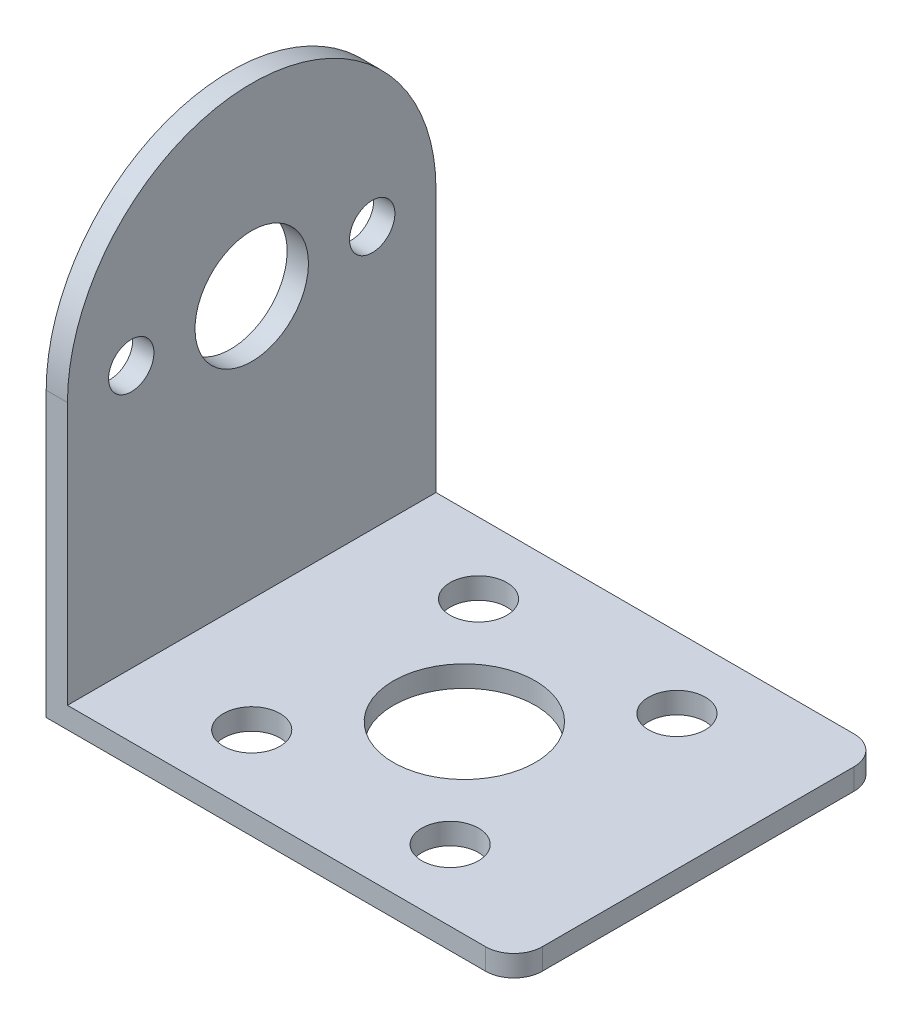
ISO-10303-21;
HEADER;
FILE_DESCRIPTION(('STEP AP214'),'2;1');
FILE_NAME('part.step','',(''),(''),'','','');
FILE_SCHEMA(('AUTOMOTIVE_DESIGN { 1 0 10303 214 1 1 1 1 }'));
ENDSEC;
DATA;
#1=APPLICATION_CONTEXT('core data for automotive mechanical design processes');
#2=APPLICATION_PROTOCOL_DEFINITION('international standard','automotive_design',2000,#1);
#3=PRODUCT_CONTEXT('',#1,'mechanical');
#4=PRODUCT('Part','Part','',(#3));
#5=PRODUCT_RELATED_PRODUCT_CATEGORY('part','',(#4));
#6=PRODUCT_DEFINITION_FORMATION('','',#4);
#7=PRODUCT_DEFINITION_CONTEXT('part definition',#1,'design');
#8=PRODUCT_DEFINITION('design','',#6,#7);
#9=PRODUCT_DEFINITION_SHAPE('','',#8);
#10=(LENGTH_UNIT() NAMED_UNIT(*) SI_UNIT(.MILLI.,.METRE.));
#11=(NAMED_UNIT(*) PLANE_ANGLE_UNIT() SI_UNIT($,.RADIAN.));
#12=(NAMED_UNIT(*) SI_UNIT($,.STERADIAN.) SOLID_ANGLE_UNIT());
#13=UNCERTAINTY_MEASURE_WITH_UNIT(LENGTH_MEASURE(1.E-05),#10,'distance_accuracy_value','');
#14=(GEOMETRIC_REPRESENTATION_CONTEXT(3) GLOBAL_UNCERTAINTY_ASSIGNED_CONTEXT((#13)) GLOBAL_UNIT_ASSIGNED_CONTEXT((#10,
#11,#12)) REPRESENTATION_CONTEXT('',''));
#15=CARTESIAN_POINT('',(0.,0.,0.));
#16=DIRECTION('',(0.,0.,1.));
#17=DIRECTION('',(1.,0.,0.));
#18=AXIS2_PLACEMENT_3D('',#15,#16,#17);
#19=CARTESIAN_POINT('',(0.,0.,26.));
#20=DIRECTION('',(1.,0.,0.));
#21=DIRECTION('',(0.,0.,-1.));
#22=AXIS2_PLACEMENT_3D('',#19,#20,#21);
#23=PLANE('',#22);
#24=CARTESIAN_POINT('',(0.,20.,21.5));
#25=DIRECTION('',(1.,0.,0.));
#26=DIRECTION('',(0.,1.,0.));
#27=AXIS2_PLACEMENT_3D('',#24,#25,#26);
#28=CIRCLE('',#27,1.6);
#29=CARTESIAN_POINT('',(0.,21.6,21.5));
#30=VERTEX_POINT('',#29);
#31=EDGE_CURVE('E254',#30,#30,#28,.T.);
#32=ORIENTED_EDGE('',*,*,#31,.T.);
#33=EDGE_LOOP('',(#32));
#34=FACE_BOUND('',#33,.T.);
#35=CARTESIAN_POINT('',(0.,20.,4.5));
#36=DIRECTION('',(1.,0.,0.));
#37=DIRECTION('',(0.,1.,0.));
#38=AXIS2_PLACEMENT_3D('',#35,#36,#37);
#39=CIRCLE('',#38,1.6);
#40=CARTESIAN_POINT('',(0.,21.6,4.5));
#41=VERTEX_POINT('',#40);
#42=EDGE_CURVE('E260',#41,#41,#39,.T.);
#43=ORIENTED_EDGE('',*,*,#42,.T.);
#44=EDGE_LOOP('',(#43));
#45=FACE_BOUND('',#44,.T.);
#46=CARTESIAN_POINT('',(0.,20.,13.));
#47=DIRECTION('',(1.,0.,0.));
#48=DIRECTION('',(0.,1.,0.));
#49=AXIS2_PLACEMENT_3D('',#46,#47,#48);
#50=CIRCLE('',#49,4.);
#51=CARTESIAN_POINT('',(0.,24.,13.));
#52=VERTEX_POINT('',#51);
#53=EDGE_CURVE('E217',#52,#52,#50,.T.);
#54=ORIENTED_EDGE('',*,*,#53,.T.);
#55=EDGE_LOOP('',(#54));
#56=FACE_BOUND('',#55,.T.);
#57=DIRECTION('',(0.,-1.,0.));
#58=VECTOR('',#57,1.);
#59=CARTESIAN_POINT('',(0.,0.,26.));
#60=LINE('',#59,#58);
#61=CARTESIAN_POINT('',(0.,20.,26.));
#62=VERTEX_POINT('',#61);
#63=CARTESIAN_POINT('',(0.,0.,26.));
#64=VERTEX_POINT('',#63);
#65=EDGE_CURVE('E120',#62,#64,#60,.T.);
#66=ORIENTED_EDGE('',*,*,#65,.F.);
#67=CARTESIAN_POINT('',(0.,20.,13.));
#68=DIRECTION('',(-1.,0.,0.));
#69=DIRECTION('',(0.,1.,0.));
#70=AXIS2_PLACEMENT_3D('',#67,#68,#69);
#71=CIRCLE('',#70,13.);
#72=CARTESIAN_POINT('',(0.,20.,0.));
#73=VERTEX_POINT('',#72);
#74=EDGE_CURVE('E106',#62,#73,#71,.T.);
#75=ORIENTED_EDGE('',*,*,#74,.T.);
#76=DIRECTION('',(0.,-1.,0.));
#77=VECTOR('',#76,1.);
#78=CARTESIAN_POINT('',(0.,0.,0.));
#79=LINE('',#78,#77);
#80=CARTESIAN_POINT('',(0.,0.,0.));
#81=VERTEX_POINT('',#80);
#82=EDGE_CURVE('E118',#73,#81,#79,.T.);
#83=ORIENTED_EDGE('',*,*,#82,.T.);
#84=DIRECTION('',(0.,0.,-1.));
#85=VECTOR('',#84,1.);
#86=CARTESIAN_POINT('',(0.,0.,26.));
#87=LINE('',#86,#85);
#88=EDGE_CURVE('E158',#64,#81,#87,.T.);
#89=ORIENTED_EDGE('',*,*,#88,.F.);
#90=EDGE_LOOP('',(#66,#75,#83,#89));
#91=FACE_BOUND('',#90,.T.);
#92=ADVANCED_FACE('F38',(#34,#45,#56,#91),#23,.F.);
#93=CARTESIAN_POINT('',(0.,0.,26.));
#94=DIRECTION('',(0.,1.,0.));
#95=DIRECTION('',(0.,0.,1.));
#96=AXIS2_PLACEMENT_3D('',#93,#94,#95);
#97=PLANE('',#96);
#98=CARTESIAN_POINT('',(9.50000000000001,0.,21.));
#99=DIRECTION('',(0.,1.,0.));
#100=DIRECTION('',(-1.,0.,0.));
#101=AXIS2_PLACEMENT_3D('',#98,#99,#100);
#102=CIRCLE('',#101,2.);
#103=CARTESIAN_POINT('',(7.50000000000001,0.,21.));
#104=VERTEX_POINT('',#103);
#105=EDGE_CURVE('E216',#104,#104,#102,.T.);
#106=ORIENTED_EDGE('',*,*,#105,.T.);
#107=EDGE_LOOP('',(#106));
#108=FACE_BOUND('',#107,.T.);
#109=CARTESIAN_POINT('',(23.5,0.,21.));
#110=DIRECTION('',(0.,1.,0.));
#111=DIRECTION('',(-1.,0.,0.));
#112=AXIS2_PLACEMENT_3D('',#109,#110,#111);
#113=CIRCLE('',#112,2.);
#114=CARTESIAN_POINT('',(21.5,0.,21.));
#115=VERTEX_POINT('',#114);
#116=EDGE_CURVE('E225',#115,#115,#113,.T.);
#117=ORIENTED_EDGE('',*,*,#116,.T.);
#118=EDGE_LOOP('',(#117));
#119=FACE_BOUND('',#118,.T.);
#120=CARTESIAN_POINT('',(23.5,0.,5.));
#121=DIRECTION('',(0.,1.,0.));
#122=DIRECTION('',(-1.,0.,0.));
#123=AXIS2_PLACEMENT_3D('',#120,#121,#122);
#124=CIRCLE('',#123,2.);
#125=CARTESIAN_POINT('',(21.5,0.,5.));
#126=VERTEX_POINT('',#125);
#127=EDGE_CURVE('E233',#126,#126,#124,.T.);
#128=ORIENTED_EDGE('',*,*,#127,.T.);
#129=EDGE_LOOP('',(#128));
#130=FACE_BOUND('',#129,.T.);
#131=CARTESIAN_POINT('',(9.50000000000001,0.,5.));
#132=DIRECTION('',(0.,1.,0.));
#133=DIRECTION('',(-1.,0.,0.));
#134=AXIS2_PLACEMENT_3D('',#131,#132,#133);
#135=CIRCLE('',#134,2.);
#136=CARTESIAN_POINT('',(7.50000000000001,0.,5.));
#137=VERTEX_POINT('',#136);
#138=EDGE_CURVE('E210',#137,#137,#135,.T.);
#139=ORIENTED_EDGE('',*,*,#138,.T.);
#140=EDGE_LOOP('',(#139));
#141=FACE_BOUND('',#140,.T.);
#142=CARTESIAN_POINT('',(16.5,0.,13.));
#143=DIRECTION('',(0.,1.,0.));
#144=DIRECTION('',(-1.,0.,0.));
#145=AXIS2_PLACEMENT_3D('',#142,#143,#144);
#146=CIRCLE('',#145,5.);
#147=CARTESIAN_POINT('',(11.5,0.,13.));
#148=VERTEX_POINT('',#147);
#149=EDGE_CURVE('E128',#148,#148,#146,.T.);
#150=ORIENTED_EDGE('',*,*,#149,.T.);
#151=EDGE_LOOP('',(#150));
#152=FACE_BOUND('',#151,.T.);
#153=DIRECTION('',(1.,0.,0.));
#154=VECTOR('',#153,1.);
#155=CARTESIAN_POINT('',(0.,0.,0.));
#156=LINE('',#155,#154);
#157=CARTESIAN_POINT('',(31.,0.,0.));
#158=VERTEX_POINT('',#157);
#159=EDGE_CURVE('E125',#81,#158,#156,.T.);
#160=ORIENTED_EDGE('',*,*,#159,.T.);
#161=CARTESIAN_POINT('',(31.,0.,2.));
#162=DIRECTION('',(0.,1.,0.));
#163=DIRECTION('',(0.,0.,1.));
#164=AXIS2_PLACEMENT_3D('',#161,#162,#163);
#165=CIRCLE('',#164,2.);
#166=CARTESIAN_POINT('',(33.,0.,2.00000000000001));
#167=VERTEX_POINT('',#166);
#168=EDGE_CURVE('E47',#158,#167,#165,.F.);
#169=ORIENTED_EDGE('',*,*,#168,.T.);
#170=DIRECTION('',(0.,0.,-1.));
#171=VECTOR('',#170,1.);
#172=CARTESIAN_POINT('',(33.,0.,26.));
#173=LINE('',#172,#171);
#174=CARTESIAN_POINT('',(33.,0.,24.));
#175=VERTEX_POINT('',#174);
#176=EDGE_CURVE('E154',#175,#167,#173,.T.);
#177=ORIENTED_EDGE('',*,*,#176,.F.);
#178=CARTESIAN_POINT('',(31.,0.,24.));
#179=DIRECTION('',(0.,1.,0.));
#180=DIRECTION('',(0.,0.,1.));
#181=AXIS2_PLACEMENT_3D('',#178,#179,#180);
#182=CIRCLE('',#181,2.);
#183=CARTESIAN_POINT('',(31.,0.,26.));
#184=VERTEX_POINT('',#183);
#185=EDGE_CURVE('E62',#175,#184,#182,.F.);
#186=ORIENTED_EDGE('',*,*,#185,.T.);
#187=DIRECTION('',(1.,0.,0.));
#188=VECTOR('',#187,1.);
#189=CARTESIAN_POINT('',(0.,0.,26.));
#190=LINE('',#189,#188);
#191=EDGE_CURVE('E201',#64,#184,#190,.T.);
#192=ORIENTED_EDGE('',*,*,#191,.F.);
#193=ORIENTED_EDGE('',*,*,#88,.T.);
#194=EDGE_LOOP('',(#160,#169,#177,#186,#192,#193));
#195=FACE_BOUND('',#194,.T.);
#196=ADVANCED_FACE('F180',(#108,#119,#130,#141,#152,#195),#97,.F.);
#197=CARTESIAN_POINT('',(33.,0.,26.));
#198=DIRECTION('',(-1.,0.,0.));
#199=DIRECTION('',(0.,-1.,0.));
#200=AXIS2_PLACEMENT_3D('',#197,#198,#199);
#201=PLANE('',#200);
#202=ORIENTED_EDGE('',*,*,#176,.T.);
#203=DIRECTION('',(0.,1.,0.));
#204=VECTOR('',#203,1.);
#205=CARTESIAN_POINT('',(33.,1.5,2.));
#206=LINE('',#205,#204);
#207=CARTESIAN_POINT('',(33.,1.5,2.00000000000001));
#208=VERTEX_POINT('',#207);
#209=EDGE_CURVE('E164',#167,#208,#206,.T.);
#210=ORIENTED_EDGE('',*,*,#209,.T.);
#211=DIRECTION('',(0.,0.,-1.));
#212=VECTOR('',#211,1.);
#213=CARTESIAN_POINT('',(33.,1.5,26.));
#214=LINE('',#213,#212);
#215=CARTESIAN_POINT('',(33.,1.5,24.));
#216=VERTEX_POINT('',#215);
#217=EDGE_CURVE('E150',#216,#208,#214,.T.);
#218=ORIENTED_EDGE('',*,*,#217,.F.);
#219=DIRECTION('',(0.,1.,0.));
#220=VECTOR('',#219,1.);
#221=CARTESIAN_POINT('',(33.,0.,24.));
#222=LINE('',#221,#220);
#223=EDGE_CURVE('E161',#216,#175,#222,.F.);
#224=ORIENTED_EDGE('',*,*,#223,.T.);
#225=EDGE_LOOP('',(#202,#210,#218,#224));
#226=FACE_BOUND('',#225,.T.);
#227=ADVANCED_FACE('F185',(#226),#201,.F.);
#228=CARTESIAN_POINT('',(33.,1.5,26.));
#229=DIRECTION('',(0.,-1.,0.));
#230=DIRECTION('',(1.,0.,0.));
#231=AXIS2_PLACEMENT_3D('',#228,#229,#230);
#232=PLANE('',#231);
#233=CARTESIAN_POINT('',(9.50000000000001,1.5,21.));
#234=DIRECTION('',(0.,1.,0.));
#235=DIRECTION('',(-1.,0.,0.));
#236=AXIS2_PLACEMENT_3D('',#233,#234,#235);
#237=CIRCLE('',#236,2.);
#238=CARTESIAN_POINT('',(7.50000000000001,1.5,21.));
#239=VERTEX_POINT('',#238);
#240=EDGE_CURVE('E212',#239,#239,#237,.T.);
#241=ORIENTED_EDGE('',*,*,#240,.F.);
#242=EDGE_LOOP('',(#241));
#243=FACE_BOUND('',#242,.T.);
#244=CARTESIAN_POINT('',(23.5,1.5,21.));
#245=DIRECTION('',(0.,1.,0.));
#246=DIRECTION('',(-1.,0.,0.));
#247=AXIS2_PLACEMENT_3D('',#244,#245,#246);
#248=CIRCLE('',#247,2.);
#249=CARTESIAN_POINT('',(21.5,1.5,21.));
#250=VERTEX_POINT('',#249);
#251=EDGE_CURVE('E221',#250,#250,#248,.T.);
#252=ORIENTED_EDGE('',*,*,#251,.F.);
#253=EDGE_LOOP('',(#252));
#254=FACE_BOUND('',#253,.T.);
#255=CARTESIAN_POINT('',(23.5,1.5,5.));
#256=DIRECTION('',(0.,1.,0.));
#257=DIRECTION('',(-1.,0.,0.));
#258=AXIS2_PLACEMENT_3D('',#255,#256,#257);
#259=CIRCLE('',#258,2.);
#260=CARTESIAN_POINT('',(21.5,1.5,5.));
#261=VERTEX_POINT('',#260);
#262=EDGE_CURVE('E229',#261,#261,#259,.T.);
#263=ORIENTED_EDGE('',*,*,#262,.F.);
#264=EDGE_LOOP('',(#263));
#265=FACE_BOUND('',#264,.T.);
#266=CARTESIAN_POINT('',(9.50000000000001,1.5,5.));
#267=DIRECTION('',(0.,1.,0.));
#268=DIRECTION('',(-1.,0.,0.));
#269=AXIS2_PLACEMENT_3D('',#266,#267,#268);
#270=CIRCLE('',#269,2.);
#271=CARTESIAN_POINT('',(7.50000000000001,1.5,5.));
#272=VERTEX_POINT('',#271);
#273=EDGE_CURVE('E237',#272,#272,#270,.T.);
#274=ORIENTED_EDGE('',*,*,#273,.F.);
#275=EDGE_LOOP('',(#274));
#276=FACE_BOUND('',#275,.T.);
#277=CARTESIAN_POINT('',(16.5,1.5,13.));
#278=DIRECTION('',(0.,1.,0.));
#279=DIRECTION('',(-1.,0.,0.));
#280=AXIS2_PLACEMENT_3D('',#277,#278,#279);
#281=CIRCLE('',#280,5.);
#282=CARTESIAN_POINT('',(11.5,1.5,13.));
#283=VERTEX_POINT('',#282);
#284=EDGE_CURVE('E135',#283,#283,#281,.T.);
#285=ORIENTED_EDGE('',*,*,#284,.F.);
#286=EDGE_LOOP('',(#285));
#287=FACE_BOUND('',#286,.T.);
#288=ORIENTED_EDGE('',*,*,#217,.T.);
#289=CARTESIAN_POINT('',(31.,1.5,2.));
#290=DIRECTION('',(0.,-1.,0.));
#291=DIRECTION('',(1.,0.,0.));
#292=AXIS2_PLACEMENT_3D('',#289,#290,#291);
#293=CIRCLE('',#292,2.);
#294=CARTESIAN_POINT('',(31.,1.5,0.));
#295=VERTEX_POINT('',#294);
#296=EDGE_CURVE('E171',#208,#295,#293,.F.);
#297=ORIENTED_EDGE('',*,*,#296,.T.);
#298=DIRECTION('',(-1.,0.,0.));
#299=VECTOR('',#298,1.);
#300=CARTESIAN_POINT('',(33.,1.5,0.));
#301=LINE('',#300,#299);
#302=CARTESIAN_POINT('',(1.5,1.49999999999999,0.));
#303=VERTEX_POINT('',#302);
#304=EDGE_CURVE('E132',#295,#303,#301,.T.);
#305=ORIENTED_EDGE('',*,*,#304,.T.);
#306=DIRECTION('',(0.,0.,-1.));
#307=VECTOR('',#306,1.);
#308=CARTESIAN_POINT('',(1.5,1.49999999999999,26.));
#309=LINE('',#308,#307);
#310=CARTESIAN_POINT('',(1.5,1.49999999999999,26.));
#311=VERTEX_POINT('',#310);
#312=EDGE_CURVE('E146',#311,#303,#309,.T.);
#313=ORIENTED_EDGE('',*,*,#312,.F.);
#314=DIRECTION('',(-1.,0.,0.));
#315=VECTOR('',#314,1.);
#316=CARTESIAN_POINT('',(33.,1.5,26.));
#317=LINE('',#316,#315);
#318=CARTESIAN_POINT('',(31.,1.5,26.));
#319=VERTEX_POINT('',#318);
#320=EDGE_CURVE('E198',#319,#311,#317,.T.);
#321=ORIENTED_EDGE('',*,*,#320,.F.);
#322=CARTESIAN_POINT('',(31.,1.5,24.));
#323=DIRECTION('',(0.,-1.,0.));
#324=DIRECTION('',(1.,0.,0.));
#325=AXIS2_PLACEMENT_3D('',#322,#323,#324);
#326=CIRCLE('',#325,2.);
#327=EDGE_CURVE('E168',#319,#216,#326,.F.);
#328=ORIENTED_EDGE('',*,*,#327,.T.);
#329=EDGE_LOOP('',(#288,#297,#305,#313,#321,#328));
#330=FACE_BOUND('',#329,.T.);
#331=ADVANCED_FACE('F191',(#243,#254,#265,#276,#287,#330),#232,.F.);
#332=CARTESIAN_POINT('',(1.5,33.,26.));
#333=DIRECTION('',(-1.,0.,0.));
#334=DIRECTION('',(0.,-1.,0.));
#335=AXIS2_PLACEMENT_3D('',#332,#333,#334);
#336=PLANE('',#335);
#337=CARTESIAN_POINT('',(1.5,20.,21.5));
#338=DIRECTION('',(1.,0.,0.));
#339=DIRECTION('',(0.,1.,0.));
#340=AXIS2_PLACEMENT_3D('',#337,#338,#339);
#341=CIRCLE('',#340,1.6);
#342=CARTESIAN_POINT('',(1.5,21.6,21.5));
#343=VERTEX_POINT('',#342);
#344=EDGE_CURVE('E256',#343,#343,#341,.T.);
#345=ORIENTED_EDGE('',*,*,#344,.F.);
#346=EDGE_LOOP('',(#345));
#347=FACE_BOUND('',#346,.T.);
#348=CARTESIAN_POINT('',(1.5,20.,4.5));
#349=DIRECTION('',(1.,0.,0.));
#350=DIRECTION('',(0.,1.,0.));
#351=AXIS2_PLACEMENT_3D('',#348,#349,#350);
#352=CIRCLE('',#351,1.6);
#353=CARTESIAN_POINT('',(1.5,21.6,4.5));
#354=VERTEX_POINT('',#353);
#355=EDGE_CURVE('E264',#354,#354,#352,.T.);
#356=ORIENTED_EDGE('',*,*,#355,.F.);
#357=EDGE_LOOP('',(#356));
#358=FACE_BOUND('',#357,.T.);
#359=CARTESIAN_POINT('',(1.5,20.,13.));
#360=DIRECTION('',(1.,0.,0.));
#361=DIRECTION('',(0.,1.,0.));
#362=AXIS2_PLACEMENT_3D('',#359,#360,#361);
#363=CIRCLE('',#362,4.);
#364=CARTESIAN_POINT('',(1.5,24.,13.));
#365=VERTEX_POINT('',#364);
#366=EDGE_CURVE('E244',#365,#365,#363,.T.);
#367=ORIENTED_EDGE('',*,*,#366,.F.);
#368=EDGE_LOOP('',(#367));
#369=FACE_BOUND('',#368,.T.);
#370=DIRECTION('',(0.,1.,0.));
#371=VECTOR('',#370,1.);
#372=CARTESIAN_POINT('',(1.5,33.,0.));
#373=LINE('',#372,#371);
#374=CARTESIAN_POINT('',(1.5,20.,0.));
#375=VERTEX_POINT('',#374);
#376=EDGE_CURVE('E143',#303,#375,#373,.T.);
#377=ORIENTED_EDGE('',*,*,#376,.T.);
#378=CARTESIAN_POINT('',(1.5,20.,13.));
#379=DIRECTION('',(-1.,0.,0.));
#380=DIRECTION('',(0.,1.,0.));
#381=AXIS2_PLACEMENT_3D('',#378,#379,#380);
#382=CIRCLE('',#381,13.);
#383=CARTESIAN_POINT('',(1.5,20.,26.));
#384=VERTEX_POINT('',#383);
#385=EDGE_CURVE('E54',#384,#375,#382,.T.);
#386=ORIENTED_EDGE('',*,*,#385,.F.);
#387=DIRECTION('',(0.,1.,0.));
#388=VECTOR('',#387,1.);
#389=CARTESIAN_POINT('',(1.5,33.,26.));
#390=LINE('',#389,#388);
#391=EDGE_CURVE('E138',#311,#384,#390,.T.);
#392=ORIENTED_EDGE('',*,*,#391,.F.);
#393=ORIENTED_EDGE('',*,*,#312,.T.);
#394=EDGE_LOOP('',(#377,#386,#392,#393));
#395=FACE_BOUND('',#394,.T.);
#396=ADVANCED_FACE('F194',(#347,#358,#369,#395),#336,.F.);
#397=CARTESIAN_POINT('',(0.,0.,26.));
#398=DIRECTION('',(0.,0.,-1.));
#399=DIRECTION('',(-1.,0.,0.));
#400=AXIS2_PLACEMENT_3D('',#397,#398,#399);
#401=PLANE('',#400);
#402=ORIENTED_EDGE('',*,*,#391,.T.);
#403=DIRECTION('',(1.,0.,0.));
#404=VECTOR('',#403,1.);
#405=CARTESIAN_POINT('',(0.,20.,26.));
#406=LINE('',#405,#404);
#407=EDGE_CURVE('E113',#62,#384,#406,.T.);
#408=ORIENTED_EDGE('',*,*,#407,.F.);
#409=ORIENTED_EDGE('',*,*,#65,.T.);
#410=ORIENTED_EDGE('',*,*,#191,.T.);
#411=DIRECTION('',(0.,1.,0.));
#412=VECTOR('',#411,1.);
#413=CARTESIAN_POINT('',(31.,-1.43403807347416E-13,26.));
#414=LINE('',#413,#412);
#415=EDGE_CURVE('E11',#184,#319,#414,.T.);
#416=ORIENTED_EDGE('',*,*,#415,.T.);
#417=ORIENTED_EDGE('',*,*,#320,.T.);
#418=EDGE_LOOP('',(#402,#408,#409,#410,#416,#417));
#419=FACE_BOUND('',#418,.T.);
#420=ADVANCED_FACE('F284',(#419),#401,.F.);
#421=CARTESIAN_POINT('',(0.,0.,0.));
#422=DIRECTION('',(0.,0.,-1.));
#423=DIRECTION('',(-1.,0.,0.));
#424=AXIS2_PLACEMENT_3D('',#421,#422,#423);
#425=PLANE('',#424);
#426=DIRECTION('',(1.,0.,0.));
#427=VECTOR('',#426,1.);
#428=CARTESIAN_POINT('',(0.,20.,0.));
#429=LINE('',#428,#427);
#430=EDGE_CURVE('E103',#73,#375,#429,.T.);
#431=ORIENTED_EDGE('',*,*,#430,.T.);
#432=ORIENTED_EDGE('',*,*,#376,.F.);
#433=ORIENTED_EDGE('',*,*,#304,.F.);
#434=DIRECTION('',(0.,1.,0.));
#435=VECTOR('',#434,1.);
#436=CARTESIAN_POINT('',(31.,0.,0.));
#437=LINE('',#436,#435);
#438=EDGE_CURVE('E174',#295,#158,#437,.F.);
#439=ORIENTED_EDGE('',*,*,#438,.T.);
#440=ORIENTED_EDGE('',*,*,#159,.F.);
#441=ORIENTED_EDGE('',*,*,#82,.F.);
#442=EDGE_LOOP('',(#431,#432,#433,#439,#440,#441));
#443=FACE_BOUND('',#442,.T.);
#444=ADVANCED_FACE('F123',(#443),#425,.T.);
#445=CARTESIAN_POINT('',(31.,0.,2.));
#446=DIRECTION('',(0.,-1.,0.));
#447=DIRECTION('',(1.,0.,0.));
#448=AXIS2_PLACEMENT_3D('',#445,#446,#447);
#449=CYLINDRICAL_SURFACE('',#448,2.);
#450=ORIENTED_EDGE('',*,*,#168,.F.);
#451=ORIENTED_EDGE('',*,*,#438,.F.);
#452=ORIENTED_EDGE('',*,*,#296,.F.);
#453=ORIENTED_EDGE('',*,*,#209,.F.);
#454=EDGE_LOOP('',(#450,#451,#452,#453));
#455=FACE_BOUND('',#454,.T.);
#456=ADVANCED_FACE('F188',(#455),#449,.T.);
#457=CARTESIAN_POINT('',(31.,-1.43403807347416E-13,24.));
#458=DIRECTION('',(0.,1.,0.));
#459=DIRECTION('',(-1.,0.,0.));
#460=AXIS2_PLACEMENT_3D('',#457,#458,#459);
#461=CYLINDRICAL_SURFACE('',#460,2.);
#462=ORIENTED_EDGE('',*,*,#185,.F.);
#463=ORIENTED_EDGE('',*,*,#223,.F.);
#464=ORIENTED_EDGE('',*,*,#327,.F.);
#465=ORIENTED_EDGE('',*,*,#415,.F.);
#466=EDGE_LOOP('',(#462,#463,#464,#465));
#467=FACE_BOUND('',#466,.T.);
#468=ADVANCED_FACE('F40',(#467),#461,.T.);
#469=CARTESIAN_POINT('',(16.5,0.,13.));
#470=DIRECTION('',(0.,1.,0.));
#471=DIRECTION('',(-1.,0.,0.));
#472=AXIS2_PLACEMENT_3D('',#469,#470,#471);
#473=CYLINDRICAL_SURFACE('',#472,5.);
#474=ORIENTED_EDGE('',*,*,#149,.F.);
#475=EDGE_LOOP('',(#474));
#476=FACE_BOUND('',#475,.T.);
#477=ORIENTED_EDGE('',*,*,#284,.T.);
#478=EDGE_LOOP('',(#477));
#479=FACE_BOUND('',#478,.T.);
#480=ADVANCED_FACE('F314',(#476,#479),#473,.F.);
#481=CARTESIAN_POINT('',(9.50000000000001,0.,5.));
#482=DIRECTION('',(0.,1.,0.));
#483=DIRECTION('',(-1.,0.,0.));
#484=AXIS2_PLACEMENT_3D('',#481,#482,#483);
#485=CYLINDRICAL_SURFACE('',#484,2.);
#486=ORIENTED_EDGE('',*,*,#138,.F.);
#487=EDGE_LOOP('',(#486));
#488=FACE_BOUND('',#487,.T.);
#489=ORIENTED_EDGE('',*,*,#273,.T.);
#490=EDGE_LOOP('',(#489));
#491=FACE_BOUND('',#490,.T.);
#492=ADVANCED_FACE('F368',(#488,#491),#485,.F.);
#493=CARTESIAN_POINT('',(23.5,0.,5.));
#494=DIRECTION('',(0.,1.,0.));
#495=DIRECTION('',(-1.,0.,0.));
#496=AXIS2_PLACEMENT_3D('',#493,#494,#495);
#497=CYLINDRICAL_SURFACE('',#496,2.);
#498=ORIENTED_EDGE('',*,*,#127,.F.);
#499=EDGE_LOOP('',(#498));
#500=FACE_BOUND('',#499,.T.);
#501=ORIENTED_EDGE('',*,*,#262,.T.);
#502=EDGE_LOOP('',(#501));
#503=FACE_BOUND('',#502,.T.);
#504=ADVANCED_FACE('F376',(#500,#503),#497,.F.);
#505=CARTESIAN_POINT('',(23.5,0.,21.));
#506=DIRECTION('',(0.,1.,0.));
#507=DIRECTION('',(-1.,0.,0.));
#508=AXIS2_PLACEMENT_3D('',#505,#506,#507);
#509=CYLINDRICAL_SURFACE('',#508,2.);
#510=ORIENTED_EDGE('',*,*,#116,.F.);
#511=EDGE_LOOP('',(#510));
#512=FACE_BOUND('',#511,.T.);
#513=ORIENTED_EDGE('',*,*,#251,.T.);
#514=EDGE_LOOP('',(#513));
#515=FACE_BOUND('',#514,.T.);
#516=ADVANCED_FACE('F384',(#512,#515),#509,.F.);
#517=CARTESIAN_POINT('',(9.50000000000001,0.,21.));
#518=DIRECTION('',(0.,1.,0.));
#519=DIRECTION('',(-1.,0.,0.));
#520=AXIS2_PLACEMENT_3D('',#517,#518,#519);
#521=CYLINDRICAL_SURFACE('',#520,2.);
#522=ORIENTED_EDGE('',*,*,#105,.F.);
#523=EDGE_LOOP('',(#522));
#524=FACE_BOUND('',#523,.T.);
#525=ORIENTED_EDGE('',*,*,#240,.T.);
#526=EDGE_LOOP('',(#525));
#527=FACE_BOUND('',#526,.T.);
#528=ADVANCED_FACE('F295',(#524,#527),#521,.F.);
#529=CARTESIAN_POINT('',(0.,20.,13.));
#530=DIRECTION('',(1.,0.,0.));
#531=DIRECTION('',(0.,1.,0.));
#532=AXIS2_PLACEMENT_3D('',#529,#530,#531);
#533=CYLINDRICAL_SURFACE('',#532,13.);
#534=ORIENTED_EDGE('',*,*,#385,.T.);
#535=ORIENTED_EDGE('',*,*,#430,.F.);
#536=ORIENTED_EDGE('',*,*,#74,.F.);
#537=ORIENTED_EDGE('',*,*,#407,.T.);
#538=EDGE_LOOP('',(#534,#535,#536,#537));
#539=FACE_BOUND('',#538,.T.);
#540=ADVANCED_FACE('F105',(#539),#533,.T.);
#541=CARTESIAN_POINT('',(0.,20.,13.));
#542=DIRECTION('',(1.,0.,0.));
#543=DIRECTION('',(0.,1.,0.));
#544=AXIS2_PLACEMENT_3D('',#541,#542,#543);
#545=CYLINDRICAL_SURFACE('',#544,4.);
#546=ORIENTED_EDGE('',*,*,#53,.F.);
#547=EDGE_LOOP('',(#546));
#548=FACE_BOUND('',#547,.T.);
#549=ORIENTED_EDGE('',*,*,#366,.T.);
#550=EDGE_LOOP('',(#549));
#551=FACE_BOUND('',#550,.T.);
#552=ADVANCED_FACE('F278',(#548,#551),#545,.F.);
#553=CARTESIAN_POINT('',(0.,20.,4.5));
#554=DIRECTION('',(1.,0.,0.));
#555=DIRECTION('',(0.,1.,0.));
#556=AXIS2_PLACEMENT_3D('',#553,#554,#555);
#557=CYLINDRICAL_SURFACE('',#556,1.6);
#558=ORIENTED_EDGE('',*,*,#42,.F.);
#559=EDGE_LOOP('',(#558));
#560=FACE_BOUND('',#559,.T.);
#561=ORIENTED_EDGE('',*,*,#355,.T.);
#562=EDGE_LOOP('',(#561));
#563=FACE_BOUND('',#562,.T.);
#564=ADVANCED_FACE('F274',(#560,#563),#557,.F.);
#565=CARTESIAN_POINT('',(0.,20.,21.5));
#566=DIRECTION('',(1.,0.,0.));
#567=DIRECTION('',(0.,1.,0.));
#568=AXIS2_PLACEMENT_3D('',#565,#566,#567);
#569=CYLINDRICAL_SURFACE('',#568,1.6);
#570=ORIENTED_EDGE('',*,*,#31,.F.);
#571=EDGE_LOOP('',(#570));
#572=FACE_BOUND('',#571,.T.);
#573=ORIENTED_EDGE('',*,*,#344,.T.);
#574=EDGE_LOOP('',(#573));
#575=FACE_BOUND('',#574,.T.);
#576=ADVANCED_FACE('F277',(#572,#575),#569,.F.);
#577=CLOSED_SHELL('',(#92,#196,#227,#331,#396,#420,#444,#456,#468,#480,#492,#504,#516,#528,#540,
#552,#564,#576));
#578=MANIFOLD_SOLID_BREP('B2',#577);
#579=ADVANCED_BREP_SHAPE_REPRESENTATION('',(#18,#578),#14);
#580=SHAPE_DEFINITION_REPRESENTATION(#9,#579);
ENDSEC;
END-ISO-10303-21;
